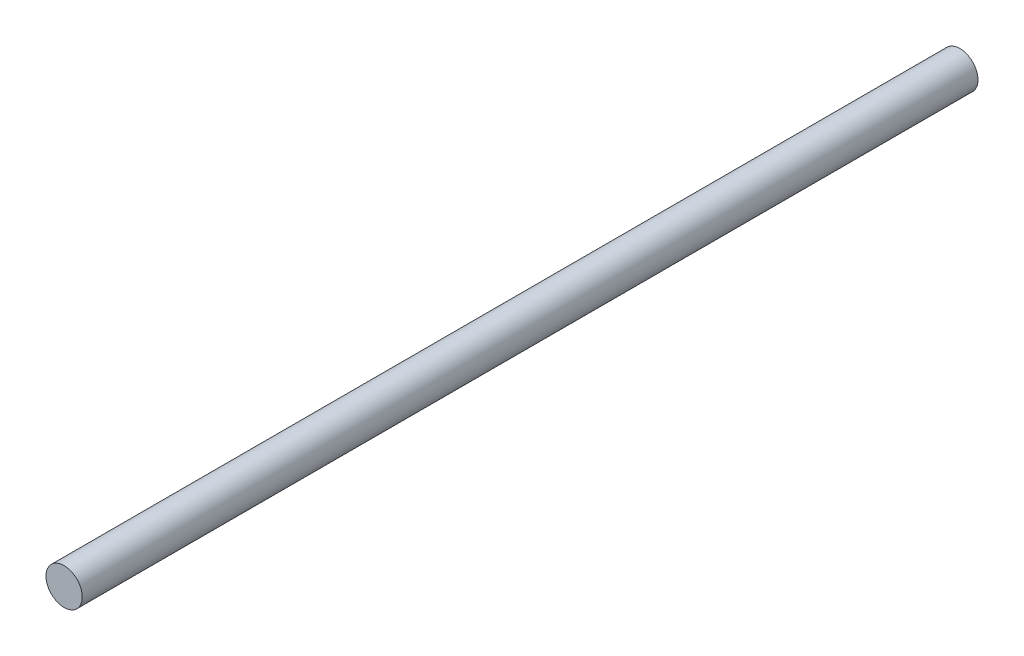
ISO-10303-21;
HEADER;
FILE_DESCRIPTION(('STEP AP214'),'2;1');
FILE_NAME('part.step','',(''),(''),'','','');
FILE_SCHEMA(('AUTOMOTIVE_DESIGN { 1 0 10303 214 1 1 1 1 }'));
ENDSEC;
DATA;
#1=APPLICATION_CONTEXT('core data for automotive mechanical design processes');
#2=APPLICATION_PROTOCOL_DEFINITION('international standard','automotive_design',2000,#1);
#3=PRODUCT_CONTEXT('',#1,'mechanical');
#4=PRODUCT('Part','Part','',(#3));
#5=PRODUCT_RELATED_PRODUCT_CATEGORY('part','',(#4));
#6=PRODUCT_DEFINITION_FORMATION('','',#4);
#7=PRODUCT_DEFINITION_CONTEXT('part definition',#1,'design');
#8=PRODUCT_DEFINITION('design','',#6,#7);
#9=PRODUCT_DEFINITION_SHAPE('','',#8);
#10=(LENGTH_UNIT() NAMED_UNIT(*) SI_UNIT(.MILLI.,.METRE.));
#11=(NAMED_UNIT(*) PLANE_ANGLE_UNIT() SI_UNIT($,.RADIAN.));
#12=(NAMED_UNIT(*) SI_UNIT($,.STERADIAN.) SOLID_ANGLE_UNIT());
#13=UNCERTAINTY_MEASURE_WITH_UNIT(LENGTH_MEASURE(1.E-05),#10,'distance_accuracy_value','');
#14=(GEOMETRIC_REPRESENTATION_CONTEXT(3) GLOBAL_UNCERTAINTY_ASSIGNED_CONTEXT((#13)) GLOBAL_UNIT_ASSIGNED_CONTEXT((#10,
#11,#12)) REPRESENTATION_CONTEXT('',''));
#15=CARTESIAN_POINT('',(0.,0.,0.));
#16=DIRECTION('',(0.,0.,1.));
#17=DIRECTION('',(1.,0.,0.));
#18=AXIS2_PLACEMENT_3D('',#15,#16,#17);
#19=CARTESIAN_POINT('',(0.,0.,200.));
#20=DIRECTION('',(0.,0.,-1.));
#21=DIRECTION('',(-1.,0.,0.));
#22=AXIS2_PLACEMENT_3D('',#19,#20,#21);
#23=CYLINDRICAL_SURFACE('',#22,4.05);
#24=CARTESIAN_POINT('',(0.,0.,200.));
#25=DIRECTION('',(0.,0.,1.));
#26=DIRECTION('',(1.,0.,0.));
#27=AXIS2_PLACEMENT_3D('',#24,#25,#26);
#28=CIRCLE('',#27,4.05);
#29=CARTESIAN_POINT('',(4.05,0.,200.));
#30=VERTEX_POINT('',#29);
#31=EDGE_CURVE('E10',#30,#30,#28,.T.);
#32=ORIENTED_EDGE('',*,*,#31,.F.);
#33=EDGE_LOOP('',(#32));
#34=FACE_BOUND('',#33,.T.);
#35=CARTESIAN_POINT('',(0.,0.,0.));
#36=DIRECTION('',(0.,0.,1.));
#37=DIRECTION('',(1.,0.,0.));
#38=AXIS2_PLACEMENT_3D('',#35,#36,#37);
#39=CIRCLE('',#38,4.05);
#40=CARTESIAN_POINT('',(4.05,0.,0.));
#41=VERTEX_POINT('',#40);
#42=EDGE_CURVE('E42',#41,#41,#39,.T.);
#43=ORIENTED_EDGE('',*,*,#42,.T.);
#44=EDGE_LOOP('',(#43));
#45=FACE_BOUND('',#44,.T.);
#46=ADVANCED_FACE('F39',(#34,#45),#23,.T.);
#47=CARTESIAN_POINT('',(0.,0.,200.));
#48=DIRECTION('',(0.,0.,1.));
#49=DIRECTION('',(1.,0.,0.));
#50=AXIS2_PLACEMENT_3D('',#47,#48,#49);
#51=PLANE('',#50);
#52=ORIENTED_EDGE('',*,*,#31,.T.);
#53=EDGE_LOOP('',(#52));
#54=FACE_BOUND('',#53,.T.);
#55=ADVANCED_FACE('F54',(#54),#51,.T.);
#56=CARTESIAN_POINT('',(0.,0.,0.));
#57=DIRECTION('',(0.,0.,1.));
#58=DIRECTION('',(1.,0.,0.));
#59=AXIS2_PLACEMENT_3D('',#56,#57,#58);
#60=PLANE('',#59);
#61=ORIENTED_EDGE('',*,*,#42,.F.);
#62=EDGE_LOOP('',(#61));
#63=FACE_BOUND('',#62,.T.);
#64=ADVANCED_FACE('F52',(#63),#60,.F.);
#65=CLOSED_SHELL('',(#46,#55,#64));
#66=MANIFOLD_SOLID_BREP('B2',#65);
#67=ADVANCED_BREP_SHAPE_REPRESENTATION('',(#18,#66),#14);
#68=SHAPE_DEFINITION_REPRESENTATION(#9,#67);
ENDSEC;
END-ISO-10303-21;
